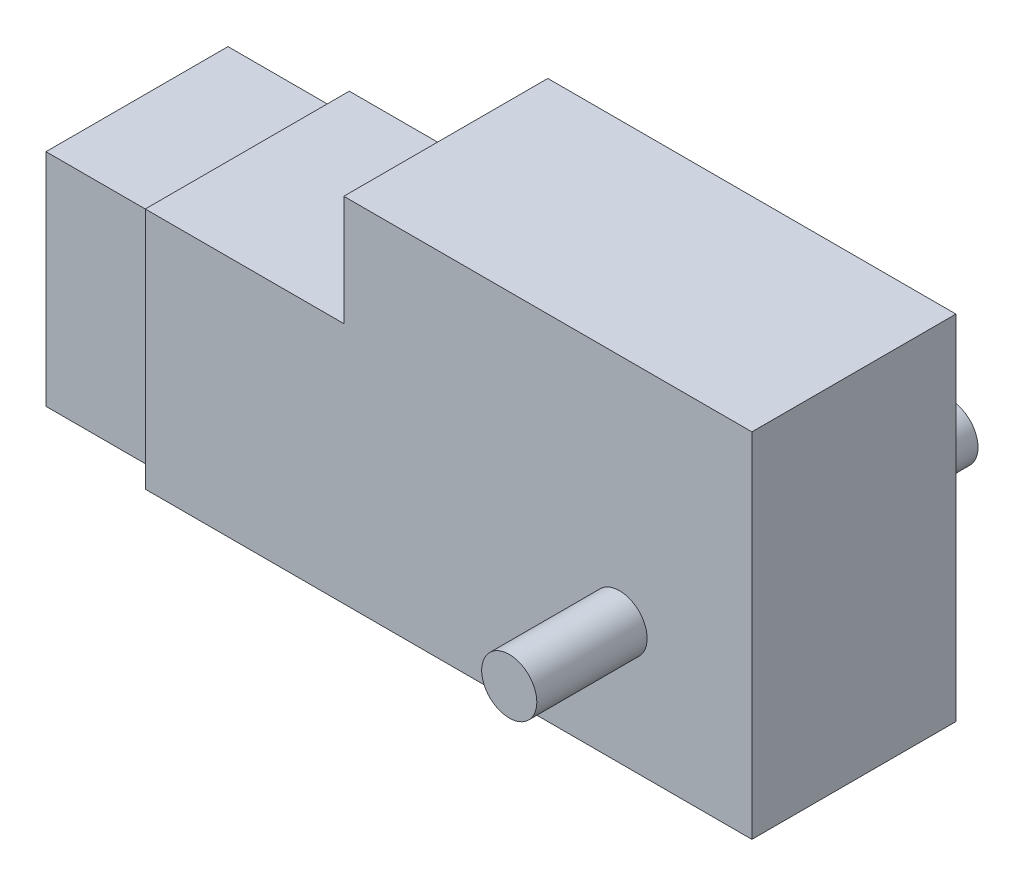
ISO-10303-21;
HEADER;
FILE_DESCRIPTION(('STEP AP214'),'2;1');
FILE_NAME('part.step','',(''),(''),'','','');
FILE_SCHEMA(('AUTOMOTIVE_DESIGN { 1 0 10303 214 1 1 1 1 }'));
ENDSEC;
DATA;
#1=APPLICATION_CONTEXT('core data for automotive mechanical design processes');
#2=APPLICATION_PROTOCOL_DEFINITION('international standard','automotive_design',2000,#1);
#3=PRODUCT_CONTEXT('',#1,'mechanical');
#4=PRODUCT('Part','Part','',(#3));
#5=PRODUCT_RELATED_PRODUCT_CATEGORY('part','',(#4));
#6=PRODUCT_DEFINITION_FORMATION('','',#4);
#7=PRODUCT_DEFINITION_CONTEXT('part definition',#1,'design');
#8=PRODUCT_DEFINITION('design','',#6,#7);
#9=PRODUCT_DEFINITION_SHAPE('','',#8);
#10=(LENGTH_UNIT() NAMED_UNIT(*) SI_UNIT(.MILLI.,.METRE.));
#11=(NAMED_UNIT(*) PLANE_ANGLE_UNIT() SI_UNIT($,.RADIAN.));
#12=(NAMED_UNIT(*) SI_UNIT($,.STERADIAN.) SOLID_ANGLE_UNIT());
#13=UNCERTAINTY_MEASURE_WITH_UNIT(LENGTH_MEASURE(1.E-05),#10,'distance_accuracy_value','');
#14=(GEOMETRIC_REPRESENTATION_CONTEXT(3) GLOBAL_UNCERTAINTY_ASSIGNED_CONTEXT((#13)) GLOBAL_UNIT_ASSIGNED_CONTEXT((#10,
#11,#12)) REPRESENTATION_CONTEXT('',''));
#15=CARTESIAN_POINT('',(0.,0.,0.));
#16=DIRECTION('',(0.,0.,1.));
#17=DIRECTION('',(1.,0.,0.));
#18=AXIS2_PLACEMENT_3D('',#15,#16,#17);
#19=CARTESIAN_POINT('',(0.,22.,0.));
#20=DIRECTION('',(0.,-1.,0.));
#21=DIRECTION('',(0.,0.,-1.));
#22=AXIS2_PLACEMENT_3D('',#19,#20,#21);
#23=PLANE('',#22);
#24=DIRECTION('',(0.,0.,1.));
#25=VECTOR('',#24,1.);
#26=CARTESIAN_POINT('',(-9.50000000000001,22.,-9.24999999999999));
#27=LINE('',#26,#25);
#28=CARTESIAN_POINT('',(-9.50000000000001,22.,-9.25));
#29=VERTEX_POINT('',#28);
#30=CARTESIAN_POINT('',(-9.50000000000001,22.,9.25));
#31=VERTEX_POINT('',#30);
#32=EDGE_CURVE('E50',#29,#31,#27,.T.);
#33=ORIENTED_EDGE('',*,*,#32,.F.);
#34=DIRECTION('',(-1.,0.,0.));
#35=VECTOR('',#34,1.);
#36=CARTESIAN_POINT('',(-27.5,22.,-9.25));
#37=LINE('',#36,#35);
#38=CARTESIAN_POINT('',(-27.5,22.,-9.25));
#39=VERTEX_POINT('',#38);
#40=EDGE_CURVE('E198',#29,#39,#37,.T.);
#41=ORIENTED_EDGE('',*,*,#40,.T.);
#42=DIRECTION('',(0.,0.,1.));
#43=VECTOR('',#42,1.);
#44=CARTESIAN_POINT('',(-27.5,22.,9.25));
#45=LINE('',#44,#43);
#46=CARTESIAN_POINT('',(-27.5,22.,9.25));
#47=VERTEX_POINT('',#46);
#48=EDGE_CURVE('E197',#39,#47,#45,.T.);
#49=ORIENTED_EDGE('',*,*,#48,.T.);
#50=DIRECTION('',(1.,0.,0.));
#51=VECTOR('',#50,1.);
#52=CARTESIAN_POINT('',(-27.5,22.,9.25));
#53=LINE('',#52,#51);
#54=EDGE_CURVE('E144',#47,#31,#53,.T.);
#55=ORIENTED_EDGE('',*,*,#54,.T.);
#56=EDGE_LOOP('',(#33,#41,#49,#55));
#57=FACE_BOUND('',#56,.T.);
#58=ADVANCED_FACE('F33',(#57),#23,.F.);
#59=CARTESIAN_POINT('',(-27.5,22.,9.25));
#60=DIRECTION('',(1.,0.,0.));
#61=DIRECTION('',(0.,0.,-1.));
#62=AXIS2_PLACEMENT_3D('',#59,#60,#61);
#63=PLANE('',#62);
#64=DIRECTION('',(0.,0.,1.));
#65=VECTOR('',#64,1.);
#66=CARTESIAN_POINT('',(-27.5,0.,9.25));
#67=LINE('',#66,#65);
#68=CARTESIAN_POINT('',(-27.5,0.,-9.25));
#69=VERTEX_POINT('',#68);
#70=CARTESIAN_POINT('',(-27.5,0.,9.25));
#71=VERTEX_POINT('',#70);
#72=EDGE_CURVE('E209',#69,#71,#67,.T.);
#73=ORIENTED_EDGE('',*,*,#72,.T.);
#74=DIRECTION('',(0.,-1.,0.));
#75=VECTOR('',#74,1.);
#76=CARTESIAN_POINT('',(-27.5,22.,9.25));
#77=LINE('',#76,#75);
#78=EDGE_CURVE('E203',#47,#71,#77,.T.);
#79=ORIENTED_EDGE('',*,*,#78,.F.);
#80=ORIENTED_EDGE('',*,*,#48,.F.);
#81=DIRECTION('',(0.,-1.,0.));
#82=VECTOR('',#81,1.);
#83=CARTESIAN_POINT('',(-27.5,22.,-9.25));
#84=LINE('',#83,#82);
#85=EDGE_CURVE('E42',#39,#69,#84,.T.);
#86=ORIENTED_EDGE('',*,*,#85,.T.);
#87=EDGE_LOOP('',(#73,#79,#80,#86));
#88=FACE_BOUND('',#87,.T.);
#89=DIRECTION('',(0.,-1.,0.));
#90=VECTOR('',#89,1.);
#91=CARTESIAN_POINT('',(-27.5,21.,-8.25));
#92=LINE('',#91,#90);
#93=CARTESIAN_POINT('',(-27.5,21.,-8.25));
#94=VERTEX_POINT('',#93);
#95=CARTESIAN_POINT('',(-27.5,1.,-8.25));
#96=VERTEX_POINT('',#95);
#97=EDGE_CURVE('E165',#94,#96,#92,.T.);
#98=ORIENTED_EDGE('',*,*,#97,.F.);
#99=DIRECTION('',(0.,0.,-1.));
#100=VECTOR('',#99,1.);
#101=CARTESIAN_POINT('',(-27.5,21.,8.25));
#102=LINE('',#101,#100);
#103=CARTESIAN_POINT('',(-27.5,21.,8.25));
#104=VERTEX_POINT('',#103);
#105=EDGE_CURVE('E170',#104,#94,#102,.T.);
#106=ORIENTED_EDGE('',*,*,#105,.F.);
#107=DIRECTION('',(0.,1.,0.));
#108=VECTOR('',#107,1.);
#109=CARTESIAN_POINT('',(-27.5,1.,8.25));
#110=LINE('',#109,#108);
#111=CARTESIAN_POINT('',(-27.5,1.,8.25));
#112=VERTEX_POINT('',#111);
#113=EDGE_CURVE('E180',#112,#104,#110,.T.);
#114=ORIENTED_EDGE('',*,*,#113,.F.);
#115=DIRECTION('',(0.,0.,1.));
#116=VECTOR('',#115,1.);
#117=CARTESIAN_POINT('',(-27.5,1.,-8.25));
#118=LINE('',#117,#116);
#119=EDGE_CURVE('E58',#96,#112,#118,.T.);
#120=ORIENTED_EDGE('',*,*,#119,.F.);
#121=EDGE_LOOP('',(#98,#106,#114,#120));
#122=FACE_BOUND('',#121,.T.);
#123=ADVANCED_FACE('F219',(#88,#122),#63,.F.);
#124=CARTESIAN_POINT('',(27.5,22.,9.25));
#125=DIRECTION('',(-1.,0.,0.));
#126=DIRECTION('',(0.,0.,1.));
#127=AXIS2_PLACEMENT_3D('',#124,#125,#126);
#128=PLANE('',#127);
#129=DIRECTION('',(0.,0.,-1.));
#130=VECTOR('',#129,1.);
#131=CARTESIAN_POINT('',(27.5,0.,9.25));
#132=LINE('',#131,#130);
#133=CARTESIAN_POINT('',(27.5,0.,9.25));
#134=VERTEX_POINT('',#133);
#135=CARTESIAN_POINT('',(27.5,0.,-9.25));
#136=VERTEX_POINT('',#135);
#137=EDGE_CURVE('E117',#134,#136,#132,.T.);
#138=ORIENTED_EDGE('',*,*,#137,.T.);
#139=DIRECTION('',(0.,-1.,0.));
#140=VECTOR('',#139,1.);
#141=CARTESIAN_POINT('',(27.5,22.,-9.25));
#142=LINE('',#141,#140);
#143=CARTESIAN_POINT('',(27.5,32.,-9.25));
#144=VERTEX_POINT('',#143);
#145=EDGE_CURVE('E11',#144,#136,#142,.T.);
#146=ORIENTED_EDGE('',*,*,#145,.F.);
#147=DIRECTION('',(0.,0.,-1.));
#148=VECTOR('',#147,1.);
#149=CARTESIAN_POINT('',(27.5,32.,-9.25));
#150=LINE('',#149,#148);
#151=CARTESIAN_POINT('',(27.5,32.,9.25));
#152=VERTEX_POINT('',#151);
#153=EDGE_CURVE('E115',#152,#144,#150,.T.);
#154=ORIENTED_EDGE('',*,*,#153,.F.);
#155=DIRECTION('',(0.,-1.,0.));
#156=VECTOR('',#155,1.);
#157=CARTESIAN_POINT('',(27.5,22.,9.25));
#158=LINE('',#157,#156);
#159=EDGE_CURVE('E206',#152,#134,#158,.T.);
#160=ORIENTED_EDGE('',*,*,#159,.T.);
#161=EDGE_LOOP('',(#138,#146,#154,#160));
#162=FACE_BOUND('',#161,.T.);
#163=ADVANCED_FACE('F35',(#162),#128,.F.);
#164=CARTESIAN_POINT('',(-27.5,22.,-9.25));
#165=DIRECTION('',(0.,0.,1.));
#166=DIRECTION('',(1.,0.,0.));
#167=AXIS2_PLACEMENT_3D('',#164,#165,#166);
#168=PLANE('',#167);
#169=CARTESIAN_POINT('',(15.5,11.0279809529743,-9.25));
#170=DIRECTION('',(0.,0.,1.));
#171=DIRECTION('',(1.,0.,0.));
#172=AXIS2_PLACEMENT_3D('',#169,#170,#171);
#173=CIRCLE('',#172,2.5);
#174=CARTESIAN_POINT('',(18.,11.0279809529743,-9.25));
#175=VERTEX_POINT('',#174);
#176=EDGE_CURVE('E160',#175,#175,#173,.T.);
#177=ORIENTED_EDGE('',*,*,#176,.T.);
#178=EDGE_LOOP('',(#177));
#179=FACE_BOUND('',#178,.T.);
#180=DIRECTION('',(-1.,0.,0.));
#181=VECTOR('',#180,1.);
#182=CARTESIAN_POINT('',(-27.5,0.,-9.25));
#183=LINE('',#182,#181);
#184=EDGE_CURVE('E211',#136,#69,#183,.T.);
#185=ORIENTED_EDGE('',*,*,#184,.T.);
#186=ORIENTED_EDGE('',*,*,#85,.F.);
#187=ORIENTED_EDGE('',*,*,#40,.F.);
#188=DIRECTION('',(0.,-1.,0.));
#189=VECTOR('',#188,1.);
#190=CARTESIAN_POINT('',(-9.50000000000001,32.,-9.24999999999999));
#191=LINE('',#190,#189);
#192=CARTESIAN_POINT('',(-9.50000000000001,32.,-9.24999999999999));
#193=VERTEX_POINT('',#192);
#194=EDGE_CURVE('E123',#193,#29,#191,.T.);
#195=ORIENTED_EDGE('',*,*,#194,.F.);
#196=DIRECTION('',(-1.,0.,0.));
#197=VECTOR('',#196,1.);
#198=CARTESIAN_POINT('',(27.5,32.,-9.25));
#199=LINE('',#198,#197);
#200=EDGE_CURVE('E120',#144,#193,#199,.T.);
#201=ORIENTED_EDGE('',*,*,#200,.F.);
#202=ORIENTED_EDGE('',*,*,#145,.T.);
#203=EDGE_LOOP('',(#185,#186,#187,#195,#201,#202));
#204=FACE_BOUND('',#203,.T.);
#205=ADVANCED_FACE('F121',(#179,#204),#168,.F.);
#206=CARTESIAN_POINT('',(-27.5,22.,9.25));
#207=DIRECTION('',(0.,0.,-1.));
#208=DIRECTION('',(-1.,0.,0.));
#209=AXIS2_PLACEMENT_3D('',#206,#207,#208);
#210=PLANE('',#209);
#211=CARTESIAN_POINT('',(15.5,11.0279809529743,9.25));
#212=DIRECTION('',(0.,0.,-1.));
#213=DIRECTION('',(-1.,0.,0.));
#214=AXIS2_PLACEMENT_3D('',#211,#212,#213);
#215=CIRCLE('',#214,2.5);
#216=CARTESIAN_POINT('',(13.,11.0279809529743,9.25));
#217=VERTEX_POINT('',#216);
#218=EDGE_CURVE('E156',#217,#217,#215,.T.);
#219=ORIENTED_EDGE('',*,*,#218,.T.);
#220=EDGE_LOOP('',(#219));
#221=FACE_BOUND('',#220,.T.);
#222=DIRECTION('',(1.,0.,0.));
#223=VECTOR('',#222,1.);
#224=CARTESIAN_POINT('',(-27.5,0.,9.25));
#225=LINE('',#224,#223);
#226=EDGE_CURVE('E199',#71,#134,#225,.T.);
#227=ORIENTED_EDGE('',*,*,#226,.T.);
#228=ORIENTED_EDGE('',*,*,#159,.F.);
#229=DIRECTION('',(1.,0.,0.));
#230=VECTOR('',#229,1.);
#231=CARTESIAN_POINT('',(27.5,32.,9.25));
#232=LINE('',#231,#230);
#233=CARTESIAN_POINT('',(-9.50000000000001,32.,9.25));
#234=VERTEX_POINT('',#233);
#235=EDGE_CURVE('E131',#234,#152,#232,.T.);
#236=ORIENTED_EDGE('',*,*,#235,.F.);
#237=DIRECTION('',(0.,-1.,0.));
#238=VECTOR('',#237,1.);
#239=CARTESIAN_POINT('',(-9.50000000000001,32.,9.25));
#240=LINE('',#239,#238);
#241=EDGE_CURVE('E137',#234,#31,#240,.T.);
#242=ORIENTED_EDGE('',*,*,#241,.T.);
#243=ORIENTED_EDGE('',*,*,#54,.F.);
#244=ORIENTED_EDGE('',*,*,#78,.T.);
#245=EDGE_LOOP('',(#227,#228,#236,#242,#243,#244));
#246=FACE_BOUND('',#245,.T.);
#247=ADVANCED_FACE('F224',(#221,#246),#210,.F.);
#248=CARTESIAN_POINT('',(0.,0.,0.));
#249=DIRECTION('',(0.,-1.,0.));
#250=DIRECTION('',(0.,0.,-1.));
#251=AXIS2_PLACEMENT_3D('',#248,#249,#250);
#252=PLANE('',#251);
#253=ORIENTED_EDGE('',*,*,#137,.F.);
#254=ORIENTED_EDGE('',*,*,#226,.F.);
#255=ORIENTED_EDGE('',*,*,#72,.F.);
#256=ORIENTED_EDGE('',*,*,#184,.F.);
#257=EDGE_LOOP('',(#253,#254,#255,#256));
#258=FACE_BOUND('',#257,.T.);
#259=ADVANCED_FACE('F222',(#258),#252,.T.);
#260=CARTESIAN_POINT('',(-37.5,21.,-8.25));
#261=DIRECTION('',(0.,0.,1.));
#262=DIRECTION('',(1.,0.,0.));
#263=AXIS2_PLACEMENT_3D('',#260,#261,#262);
#264=PLANE('',#263);
#265=ORIENTED_EDGE('',*,*,#97,.T.);
#266=DIRECTION('',(1.,0.,0.));
#267=VECTOR('',#266,1.);
#268=CARTESIAN_POINT('',(-37.5,1.,-8.25));
#269=LINE('',#268,#267);
#270=CARTESIAN_POINT('',(-37.5,1.,-8.25));
#271=VERTEX_POINT('',#270);
#272=EDGE_CURVE('E193',#271,#96,#269,.T.);
#273=ORIENTED_EDGE('',*,*,#272,.F.);
#274=DIRECTION('',(0.,-1.,0.));
#275=VECTOR('',#274,1.);
#276=CARTESIAN_POINT('',(-37.5,21.,-8.25));
#277=LINE('',#276,#275);
#278=CARTESIAN_POINT('',(-37.5,21.,-8.25));
#279=VERTEX_POINT('',#278);
#280=EDGE_CURVE('E166',#279,#271,#277,.T.);
#281=ORIENTED_EDGE('',*,*,#280,.F.);
#282=DIRECTION('',(1.,0.,0.));
#283=VECTOR('',#282,1.);
#284=CARTESIAN_POINT('',(-37.5,21.,-8.25));
#285=LINE('',#284,#283);
#286=EDGE_CURVE('E176',#279,#94,#285,.T.);
#287=ORIENTED_EDGE('',*,*,#286,.T.);
#288=EDGE_LOOP('',(#265,#273,#281,#287));
#289=FACE_BOUND('',#288,.T.);
#290=ADVANCED_FACE('F235',(#289),#264,.F.);
#291=CARTESIAN_POINT('',(-37.5,1.,-8.25));
#292=DIRECTION('',(0.,1.,0.));
#293=DIRECTION('',(0.,0.,1.));
#294=AXIS2_PLACEMENT_3D('',#291,#292,#293);
#295=PLANE('',#294);
#296=ORIENTED_EDGE('',*,*,#119,.T.);
#297=DIRECTION('',(1.,0.,0.));
#298=VECTOR('',#297,1.);
#299=CARTESIAN_POINT('',(-37.5,1.,8.25));
#300=LINE('',#299,#298);
#301=CARTESIAN_POINT('',(-37.5,1.,8.25));
#302=VERTEX_POINT('',#301);
#303=EDGE_CURVE('E190',#302,#112,#300,.T.);
#304=ORIENTED_EDGE('',*,*,#303,.F.);
#305=DIRECTION('',(0.,0.,1.));
#306=VECTOR('',#305,1.);
#307=CARTESIAN_POINT('',(-37.5,1.,-8.25));
#308=LINE('',#307,#306);
#309=EDGE_CURVE('E169',#271,#302,#308,.T.);
#310=ORIENTED_EDGE('',*,*,#309,.F.);
#311=ORIENTED_EDGE('',*,*,#272,.T.);
#312=EDGE_LOOP('',(#296,#304,#310,#311));
#313=FACE_BOUND('',#312,.T.);
#314=ADVANCED_FACE('F274',(#313),#295,.F.);
#315=CARTESIAN_POINT('',(-37.5,1.,8.25));
#316=DIRECTION('',(0.,0.,-1.));
#317=DIRECTION('',(-1.,0.,0.));
#318=AXIS2_PLACEMENT_3D('',#315,#316,#317);
#319=PLANE('',#318);
#320=ORIENTED_EDGE('',*,*,#113,.T.);
#321=DIRECTION('',(1.,0.,0.));
#322=VECTOR('',#321,1.);
#323=CARTESIAN_POINT('',(-37.5,21.,8.25));
#324=LINE('',#323,#322);
#325=CARTESIAN_POINT('',(-37.5,21.,8.25));
#326=VERTEX_POINT('',#325);
#327=EDGE_CURVE('E187',#326,#104,#324,.T.);
#328=ORIENTED_EDGE('',*,*,#327,.F.);
#329=DIRECTION('',(0.,1.,0.));
#330=VECTOR('',#329,1.);
#331=CARTESIAN_POINT('',(-37.5,1.,8.25));
#332=LINE('',#331,#330);
#333=EDGE_CURVE('E172',#302,#326,#332,.T.);
#334=ORIENTED_EDGE('',*,*,#333,.F.);
#335=ORIENTED_EDGE('',*,*,#303,.T.);
#336=EDGE_LOOP('',(#320,#328,#334,#335));
#337=FACE_BOUND('',#336,.T.);
#338=ADVANCED_FACE('F271',(#337),#319,.F.);
#339=CARTESIAN_POINT('',(-37.5,21.,8.25));
#340=DIRECTION('',(0.,-1.,0.));
#341=DIRECTION('',(0.,0.,-1.));
#342=AXIS2_PLACEMENT_3D('',#339,#340,#341);
#343=PLANE('',#342);
#344=ORIENTED_EDGE('',*,*,#105,.T.);
#345=ORIENTED_EDGE('',*,*,#286,.F.);
#346=DIRECTION('',(0.,0.,-1.));
#347=VECTOR('',#346,1.);
#348=CARTESIAN_POINT('',(-37.5,21.,8.25));
#349=LINE('',#348,#347);
#350=EDGE_CURVE('E174',#326,#279,#349,.T.);
#351=ORIENTED_EDGE('',*,*,#350,.F.);
#352=ORIENTED_EDGE('',*,*,#327,.T.);
#353=EDGE_LOOP('',(#344,#345,#351,#352));
#354=FACE_BOUND('',#353,.T.);
#355=ADVANCED_FACE('F267',(#354),#343,.F.);
#356=CARTESIAN_POINT('',(-37.5,0.,0.));
#357=DIRECTION('',(-1.,0.,0.));
#358=DIRECTION('',(0.,0.,1.));
#359=AXIS2_PLACEMENT_3D('',#356,#357,#358);
#360=PLANE('',#359);
#361=ORIENTED_EDGE('',*,*,#280,.T.);
#362=ORIENTED_EDGE('',*,*,#309,.T.);
#363=ORIENTED_EDGE('',*,*,#333,.T.);
#364=ORIENTED_EDGE('',*,*,#350,.T.);
#365=EDGE_LOOP('',(#361,#362,#363,#364));
#366=FACE_BOUND('',#365,.T.);
#367=ADVANCED_FACE('F264',(#366),#360,.T.);
#368=CARTESIAN_POINT('',(15.5,11.0279809529743,19.25));
#369=DIRECTION('',(0.,0.,1.));
#370=DIRECTION('',(1.,0.,0.));
#371=AXIS2_PLACEMENT_3D('',#368,#369,#370);
#372=PLANE('',#371);
#373=CARTESIAN_POINT('',(15.5,11.0279809529743,19.25));
#374=DIRECTION('',(0.,0.,1.));
#375=DIRECTION('',(1.,0.,0.));
#376=AXIS2_PLACEMENT_3D('',#373,#374,#375);
#377=CIRCLE('',#376,2.5);
#378=CARTESIAN_POINT('',(18.,11.0279809529743,19.25));
#379=VERTEX_POINT('',#378);
#380=EDGE_CURVE('E140',#379,#379,#377,.T.);
#381=ORIENTED_EDGE('',*,*,#380,.T.);
#382=EDGE_LOOP('',(#381));
#383=FACE_BOUND('',#382,.T.);
#384=ADVANCED_FACE('F260',(#383),#372,.T.);
#385=CARTESIAN_POINT('',(15.5,11.0279809529743,-20.75));
#386=DIRECTION('',(0.,0.,1.));
#387=DIRECTION('',(1.,0.,0.));
#388=AXIS2_PLACEMENT_3D('',#385,#386,#387);
#389=CYLINDRICAL_SURFACE('',#388,2.5);
#390=ORIENTED_EDGE('',*,*,#380,.F.);
#391=EDGE_LOOP('',(#390));
#392=FACE_BOUND('',#391,.T.);
#393=ORIENTED_EDGE('',*,*,#218,.F.);
#394=EDGE_LOOP('',(#393));
#395=FACE_BOUND('',#394,.T.);
#396=ADVANCED_FACE('F251',(#392,#395),#389,.T.);
#397=CARTESIAN_POINT('',(15.5,11.0279809529743,-20.75));
#398=DIRECTION('',(0.,0.,1.));
#399=DIRECTION('',(1.,0.,0.));
#400=AXIS2_PLACEMENT_3D('',#397,#398,#399);
#401=CIRCLE('',#400,2.5);
#402=CARTESIAN_POINT('',(18.,11.0279809529743,-20.75));
#403=VERTEX_POINT('',#402);
#404=EDGE_CURVE('E152',#403,#403,#401,.T.);
#405=ORIENTED_EDGE('',*,*,#404,.T.);
#406=EDGE_LOOP('',(#405));
#407=FACE_BOUND('',#406,.T.);
#408=ORIENTED_EDGE('',*,*,#176,.F.);
#409=EDGE_LOOP('',(#408));
#410=FACE_BOUND('',#409,.T.);
#411=ADVANCED_FACE('F248',(#407,#410),#389,.T.);
#412=CARTESIAN_POINT('',(15.5,11.0279809529743,-20.75));
#413=DIRECTION('',(0.,0.,1.));
#414=DIRECTION('',(1.,0.,0.));
#415=AXIS2_PLACEMENT_3D('',#412,#413,#414);
#416=PLANE('',#415);
#417=ORIENTED_EDGE('',*,*,#404,.F.);
#418=EDGE_LOOP('',(#417));
#419=FACE_BOUND('',#418,.T.);
#420=ADVANCED_FACE('F250',(#419),#416,.F.);
#421=CARTESIAN_POINT('',(-9.50000000000001,32.,-9.24999999999999));
#422=DIRECTION('',(1.,0.,0.));
#423=DIRECTION('',(0.,0.,-1.));
#424=AXIS2_PLACEMENT_3D('',#421,#422,#423);
#425=PLANE('',#424);
#426=ORIENTED_EDGE('',*,*,#32,.T.);
#427=ORIENTED_EDGE('',*,*,#241,.F.);
#428=DIRECTION('',(0.,0.,1.));
#429=VECTOR('',#428,1.);
#430=CARTESIAN_POINT('',(-9.50000000000001,32.,-9.24999999999999));
#431=LINE('',#430,#429);
#432=EDGE_CURVE('E126',#193,#234,#431,.T.);
#433=ORIENTED_EDGE('',*,*,#432,.F.);
#434=ORIENTED_EDGE('',*,*,#194,.T.);
#435=EDGE_LOOP('',(#426,#427,#433,#434));
#436=FACE_BOUND('',#435,.T.);
#437=ADVANCED_FACE('F257',(#436),#425,.F.);
#438=CARTESIAN_POINT('',(0.,32.,0.));
#439=DIRECTION('',(0.,-1.,0.));
#440=DIRECTION('',(0.,0.,-1.));
#441=AXIS2_PLACEMENT_3D('',#438,#439,#440);
#442=PLANE('',#441);
#443=ORIENTED_EDGE('',*,*,#153,.T.);
#444=ORIENTED_EDGE('',*,*,#200,.T.);
#445=ORIENTED_EDGE('',*,*,#432,.T.);
#446=ORIENTED_EDGE('',*,*,#235,.T.);
#447=EDGE_LOOP('',(#443,#444,#445,#446));
#448=FACE_BOUND('',#447,.T.);
#449=ADVANCED_FACE('F129',(#448),#442,.F.);
#450=CLOSED_SHELL('',(#58,#123,#163,#205,#247,#259,#290,#314,#338,#355,#367,#384,#396,#411,#420,
#437,#449));
#451=MANIFOLD_SOLID_BREP('B2',#450);
#452=ADVANCED_BREP_SHAPE_REPRESENTATION('',(#18,#451),#14);
#453=SHAPE_DEFINITION_REPRESENTATION(#9,#452);
ENDSEC;
END-ISO-10303-21;
